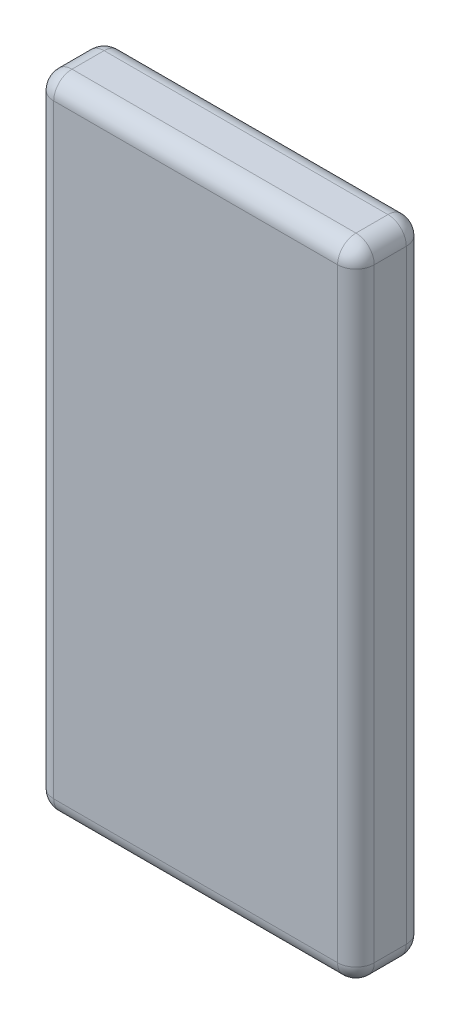
ISO-10303-21;
HEADER;
FILE_DESCRIPTION(('STEP AP214'),'2;1');
FILE_NAME('part.step','',(''),(''),'','','');
FILE_SCHEMA(('AUTOMOTIVE_DESIGN { 1 0 10303 214 1 1 1 1 }'));
ENDSEC;
DATA;
#1=APPLICATION_CONTEXT('core data for automotive mechanical design processes');
#2=APPLICATION_PROTOCOL_DEFINITION('international standard','automotive_design',2000,#1);
#3=PRODUCT_CONTEXT('',#1,'mechanical');
#4=PRODUCT('Part','Part','',(#3));
#5=PRODUCT_RELATED_PRODUCT_CATEGORY('part','',(#4));
#6=PRODUCT_DEFINITION_FORMATION('','',#4);
#7=PRODUCT_DEFINITION_CONTEXT('part definition',#1,'design');
#8=PRODUCT_DEFINITION('design','',#6,#7);
#9=PRODUCT_DEFINITION_SHAPE('','',#8);
#10=(LENGTH_UNIT() NAMED_UNIT(*) SI_UNIT(.MILLI.,.METRE.));
#11=(NAMED_UNIT(*) PLANE_ANGLE_UNIT() SI_UNIT($,.RADIAN.));
#12=(NAMED_UNIT(*) SI_UNIT($,.STERADIAN.) SOLID_ANGLE_UNIT());
#13=UNCERTAINTY_MEASURE_WITH_UNIT(LENGTH_MEASURE(1.E-05),#10,'distance_accuracy_value','');
#14=(GEOMETRIC_REPRESENTATION_CONTEXT(3) GLOBAL_UNCERTAINTY_ASSIGNED_CONTEXT((#13)) GLOBAL_UNIT_ASSIGNED_CONTEXT((#10,
#11,#12)) REPRESENTATION_CONTEXT('',''));
#15=CARTESIAN_POINT('',(0.,0.,0.));
#16=DIRECTION('',(0.,0.,1.));
#17=DIRECTION('',(1.,0.,0.));
#18=AXIS2_PLACEMENT_3D('',#15,#16,#17);
#19=CARTESIAN_POINT('',(0.,0.,15.));
#20=DIRECTION('',(-1.,0.,0.));
#21=DIRECTION('',(0.,0.,1.));
#22=AXIS2_PLACEMENT_3D('',#19,#20,#21);
#23=PLANE('',#22);
#24=DIRECTION('',(0.,0.,-1.));
#25=VECTOR('',#24,1.);
#26=CARTESIAN_POINT('',(0.,-136.,15.));
#27=LINE('',#26,#25);
#28=CARTESIAN_POINT('',(0.,-136.,11.));
#29=VERTEX_POINT('',#28);
#30=CARTESIAN_POINT('',(0.,-136.,4.));
#31=VERTEX_POINT('',#30);
#32=EDGE_CURVE('E258',#29,#31,#27,.T.);
#33=ORIENTED_EDGE('',*,*,#32,.T.);
#34=DIRECTION('',(0.,1.,0.));
#35=VECTOR('',#34,1.);
#36=CARTESIAN_POINT('',(0.,-4.,4.));
#37=LINE('',#36,#35);
#38=CARTESIAN_POINT('',(0.,-4.,4.));
#39=VERTEX_POINT('',#38);
#40=EDGE_CURVE('E11',#31,#39,#37,.T.);
#41=ORIENTED_EDGE('',*,*,#40,.T.);
#42=DIRECTION('',(0.,0.,-1.));
#43=VECTOR('',#42,1.);
#44=CARTESIAN_POINT('',(0.,-4.,15.));
#45=LINE('',#44,#43);
#46=CARTESIAN_POINT('',(0.,-4.,11.));
#47=VERTEX_POINT('',#46);
#48=EDGE_CURVE('E207',#39,#47,#45,.F.);
#49=ORIENTED_EDGE('',*,*,#48,.T.);
#50=DIRECTION('',(0.,1.,0.));
#51=VECTOR('',#50,1.);
#52=CARTESIAN_POINT('',(0.,0.,11.));
#53=LINE('',#52,#51);
#54=EDGE_CURVE('E183',#47,#29,#53,.F.);
#55=ORIENTED_EDGE('',*,*,#54,.T.);
#56=EDGE_LOOP('',(#33,#41,#49,#55));
#57=FACE_BOUND('',#56,.T.);
#58=ADVANCED_FACE('F35',(#57),#23,.F.);
#59=CARTESIAN_POINT('',(0.,0.,15.));
#60=DIRECTION('',(0.,-1.,0.));
#61=DIRECTION('',(0.,0.,-1.));
#62=AXIS2_PLACEMENT_3D('',#59,#60,#61);
#63=PLANE('',#62);
#64=DIRECTION('',(0.,0.,-1.));
#65=VECTOR('',#64,1.);
#66=CARTESIAN_POINT('',(-4.,0.,15.));
#67=LINE('',#66,#65);
#68=CARTESIAN_POINT('',(-4.,0.,11.));
#69=VERTEX_POINT('',#68);
#70=CARTESIAN_POINT('',(-4.,0.,4.));
#71=VERTEX_POINT('',#70);
#72=EDGE_CURVE('E137',#69,#71,#67,.T.);
#73=ORIENTED_EDGE('',*,*,#72,.T.);
#74=DIRECTION('',(-1.,0.,0.));
#75=VECTOR('',#74,1.);
#76=CARTESIAN_POINT('',(-66.,0.,4.));
#77=LINE('',#76,#75);
#78=CARTESIAN_POINT('',(-66.,0.,4.));
#79=VERTEX_POINT('',#78);
#80=EDGE_CURVE('E210',#71,#79,#77,.T.);
#81=ORIENTED_EDGE('',*,*,#80,.T.);
#82=DIRECTION('',(0.,0.,-1.));
#83=VECTOR('',#82,1.);
#84=CARTESIAN_POINT('',(-66.,0.,15.));
#85=LINE('',#84,#83);
#86=CARTESIAN_POINT('',(-66.,0.,11.));
#87=VERTEX_POINT('',#86);
#88=EDGE_CURVE('E164',#79,#87,#85,.F.);
#89=ORIENTED_EDGE('',*,*,#88,.T.);
#90=DIRECTION('',(-1.,0.,0.));
#91=VECTOR('',#90,1.);
#92=CARTESIAN_POINT('',(0.,0.,11.));
#93=LINE('',#92,#91);
#94=EDGE_CURVE('E178',#87,#69,#93,.F.);
#95=ORIENTED_EDGE('',*,*,#94,.T.);
#96=EDGE_LOOP('',(#73,#81,#89,#95));
#97=FACE_BOUND('',#96,.T.);
#98=ADVANCED_FACE('F267',(#97),#63,.F.);
#99=CARTESIAN_POINT('',(-70.,0.,15.));
#100=DIRECTION('',(1.,0.,0.));
#101=DIRECTION('',(0.,0.,-1.));
#102=AXIS2_PLACEMENT_3D('',#99,#100,#101);
#103=PLANE('',#102);
#104=DIRECTION('',(0.,0.,-1.));
#105=VECTOR('',#104,1.);
#106=CARTESIAN_POINT('',(-70.,-4.,15.));
#107=LINE('',#106,#105);
#108=CARTESIAN_POINT('',(-70.,-4.,11.));
#109=VERTEX_POINT('',#108);
#110=CARTESIAN_POINT('',(-70.,-4.,4.));
#111=VERTEX_POINT('',#110);
#112=EDGE_CURVE('E138',#109,#111,#107,.T.);
#113=ORIENTED_EDGE('',*,*,#112,.T.);
#114=DIRECTION('',(0.,-1.,0.));
#115=VECTOR('',#114,1.);
#116=CARTESIAN_POINT('',(-70.,-136.,4.));
#117=LINE('',#116,#115);
#118=CARTESIAN_POINT('',(-70.,-136.,4.));
#119=VERTEX_POINT('',#118);
#120=EDGE_CURVE('E133',#111,#119,#117,.T.);
#121=ORIENTED_EDGE('',*,*,#120,.T.);
#122=DIRECTION('',(0.,0.,-1.));
#123=VECTOR('',#122,1.);
#124=CARTESIAN_POINT('',(-70.,-136.,15.));
#125=LINE('',#124,#123);
#126=CARTESIAN_POINT('',(-70.,-136.,11.));
#127=VERTEX_POINT('',#126);
#128=EDGE_CURVE('E125',#119,#127,#125,.F.);
#129=ORIENTED_EDGE('',*,*,#128,.T.);
#130=DIRECTION('',(0.,-1.,0.));
#131=VECTOR('',#130,1.);
#132=CARTESIAN_POINT('',(-70.,0.,11.));
#133=LINE('',#132,#131);
#134=EDGE_CURVE('E130',#127,#109,#133,.F.);
#135=ORIENTED_EDGE('',*,*,#134,.T.);
#136=EDGE_LOOP('',(#113,#121,#129,#135));
#137=FACE_BOUND('',#136,.T.);
#138=ADVANCED_FACE('F128',(#137),#103,.F.);
#139=CARTESIAN_POINT('',(0.,-140.,15.));
#140=DIRECTION('',(0.,1.,0.));
#141=DIRECTION('',(0.,0.,1.));
#142=AXIS2_PLACEMENT_3D('',#139,#140,#141);
#143=PLANE('',#142);
#144=DIRECTION('',(0.,0.,-1.));
#145=VECTOR('',#144,1.);
#146=CARTESIAN_POINT('',(-66.,-140.,15.));
#147=LINE('',#146,#145);
#148=CARTESIAN_POINT('',(-66.,-140.,11.));
#149=VERTEX_POINT('',#148);
#150=CARTESIAN_POINT('',(-66.,-140.,4.));
#151=VERTEX_POINT('',#150);
#152=EDGE_CURVE('E162',#149,#151,#147,.T.);
#153=ORIENTED_EDGE('',*,*,#152,.T.);
#154=DIRECTION('',(1.,0.,0.));
#155=VECTOR('',#154,1.);
#156=CARTESIAN_POINT('',(-4.,-140.,4.));
#157=LINE('',#156,#155);
#158=CARTESIAN_POINT('',(-4.,-140.,4.));
#159=VERTEX_POINT('',#158);
#160=EDGE_CURVE('E59',#151,#159,#157,.T.);
#161=ORIENTED_EDGE('',*,*,#160,.T.);
#162=DIRECTION('',(0.,0.,-1.));
#163=VECTOR('',#162,1.);
#164=CARTESIAN_POINT('',(-4.,-140.,15.));
#165=LINE('',#164,#163);
#166=CARTESIAN_POINT('',(-4.,-140.,11.));
#167=VERTEX_POINT('',#166);
#168=EDGE_CURVE('E257',#159,#167,#165,.F.);
#169=ORIENTED_EDGE('',*,*,#168,.T.);
#170=DIRECTION('',(1.,0.,0.));
#171=VECTOR('',#170,1.);
#172=CARTESIAN_POINT('',(0.,-140.,11.));
#173=LINE('',#172,#171);
#174=EDGE_CURVE('E188',#167,#149,#173,.F.);
#175=ORIENTED_EDGE('',*,*,#174,.T.);
#176=EDGE_LOOP('',(#153,#161,#169,#175));
#177=FACE_BOUND('',#176,.T.);
#178=ADVANCED_FACE('F255',(#177),#143,.F.);
#179=CARTESIAN_POINT('',(0.,0.,15.));
#180=DIRECTION('',(0.,0.,-1.));
#181=DIRECTION('',(-1.,0.,0.));
#182=AXIS2_PLACEMENT_3D('',#179,#180,#181);
#183=PLANE('',#182);
#184=DIRECTION('',(-1.,0.,0.));
#185=VECTOR('',#184,1.);
#186=CARTESIAN_POINT('',(0.,-4.,15.));
#187=LINE('',#186,#185);
#188=CARTESIAN_POINT('',(-4.,-4.,15.));
#189=VERTEX_POINT('',#188);
#190=CARTESIAN_POINT('',(-66.,-4.,15.));
#191=VERTEX_POINT('',#190);
#192=EDGE_CURVE('E172',#189,#191,#187,.T.);
#193=ORIENTED_EDGE('',*,*,#192,.T.);
#194=DIRECTION('',(0.,-1.,0.));
#195=VECTOR('',#194,1.);
#196=CARTESIAN_POINT('',(-66.,0.,15.));
#197=LINE('',#196,#195);
#198=CARTESIAN_POINT('',(-66.,-136.,15.));
#199=VERTEX_POINT('',#198);
#200=EDGE_CURVE('E158',#191,#199,#197,.T.);
#201=ORIENTED_EDGE('',*,*,#200,.T.);
#202=DIRECTION('',(1.,0.,0.));
#203=VECTOR('',#202,1.);
#204=CARTESIAN_POINT('',(0.,-136.,15.));
#205=LINE('',#204,#203);
#206=CARTESIAN_POINT('',(-4.,-136.,15.));
#207=VERTEX_POINT('',#206);
#208=EDGE_CURVE('E163',#199,#207,#205,.T.);
#209=ORIENTED_EDGE('',*,*,#208,.T.);
#210=DIRECTION('',(0.,1.,0.));
#211=VECTOR('',#210,1.);
#212=CARTESIAN_POINT('',(-4.,0.,15.));
#213=LINE('',#212,#211);
#214=EDGE_CURVE('E166',#207,#189,#213,.T.);
#215=ORIENTED_EDGE('',*,*,#214,.T.);
#216=EDGE_LOOP('',(#193,#201,#209,#215));
#217=FACE_BOUND('',#216,.T.);
#218=ADVANCED_FACE('F286',(#217),#183,.F.);
#219=CARTESIAN_POINT('',(0.,0.,0.));
#220=DIRECTION('',(0.,0.,-1.));
#221=DIRECTION('',(-1.,0.,0.));
#222=AXIS2_PLACEMENT_3D('',#219,#220,#221);
#223=PLANE('',#222);
#224=DIRECTION('',(0.,-1.,0.));
#225=VECTOR('',#224,1.);
#226=CARTESIAN_POINT('',(-66.,-4.,0.));
#227=LINE('',#226,#225);
#228=CARTESIAN_POINT('',(-66.,-136.,0.));
#229=VERTEX_POINT('',#228);
#230=CARTESIAN_POINT('',(-66.,-4.,0.));
#231=VERTEX_POINT('',#230);
#232=EDGE_CURVE('E216',#229,#231,#227,.F.);
#233=ORIENTED_EDGE('',*,*,#232,.T.);
#234=DIRECTION('',(-1.,0.,0.));
#235=VECTOR('',#234,1.);
#236=CARTESIAN_POINT('',(-4.,-4.,0.));
#237=LINE('',#236,#235);
#238=CARTESIAN_POINT('',(-4.,-4.,0.));
#239=VERTEX_POINT('',#238);
#240=EDGE_CURVE('E218',#231,#239,#237,.F.);
#241=ORIENTED_EDGE('',*,*,#240,.T.);
#242=DIRECTION('',(0.,1.,0.));
#243=VECTOR('',#242,1.);
#244=CARTESIAN_POINT('',(-4.,-136.,0.));
#245=LINE('',#244,#243);
#246=CARTESIAN_POINT('',(-4.,-136.,0.));
#247=VERTEX_POINT('',#246);
#248=EDGE_CURVE('E212',#239,#247,#245,.F.);
#249=ORIENTED_EDGE('',*,*,#248,.T.);
#250=DIRECTION('',(1.,0.,0.));
#251=VECTOR('',#250,1.);
#252=CARTESIAN_POINT('',(-66.,-136.,0.));
#253=LINE('',#252,#251);
#254=EDGE_CURVE('E214',#247,#229,#253,.F.);
#255=ORIENTED_EDGE('',*,*,#254,.T.);
#256=EDGE_LOOP('',(#233,#241,#249,#255));
#257=FACE_BOUND('',#256,.T.);
#258=ADVANCED_FACE('F319',(#257),#223,.T.);
#259=CARTESIAN_POINT('',(-4.,-136.,15.));
#260=DIRECTION('',(0.,0.,-1.));
#261=DIRECTION('',(-1.,0.,0.));
#262=AXIS2_PLACEMENT_3D('',#259,#260,#261);
#263=CYLINDRICAL_SURFACE('',#262,4.);
#264=ORIENTED_EDGE('',*,*,#168,.F.);
#265=CARTESIAN_POINT('',(-4.,-136.,4.));
#266=DIRECTION('',(0.,0.,-1.));
#267=DIRECTION('',(-1.,0.,0.));
#268=AXIS2_PLACEMENT_3D('',#265,#266,#267);
#269=CIRCLE('',#268,4.);
#270=EDGE_CURVE('E44',#159,#31,#269,.F.);
#271=ORIENTED_EDGE('',*,*,#270,.T.);
#272=ORIENTED_EDGE('',*,*,#32,.F.);
#273=CARTESIAN_POINT('',(-4.,-136.,11.));
#274=DIRECTION('',(0.,0.,-1.));
#275=DIRECTION('',(-1.,0.,0.));
#276=AXIS2_PLACEMENT_3D('',#273,#274,#275);
#277=CIRCLE('',#276,4.);
#278=EDGE_CURVE('E185',#29,#167,#277,.T.);
#279=ORIENTED_EDGE('',*,*,#278,.T.);
#280=EDGE_LOOP('',(#264,#271,#272,#279));
#281=FACE_BOUND('',#280,.T.);
#282=ADVANCED_FACE('F294',(#281),#263,.T.);
#283=CARTESIAN_POINT('',(-66.,-136.,15.));
#284=DIRECTION('',(0.,0.,-1.));
#285=DIRECTION('',(-1.,0.,0.));
#286=AXIS2_PLACEMENT_3D('',#283,#284,#285);
#287=CYLINDRICAL_SURFACE('',#286,4.);
#288=ORIENTED_EDGE('',*,*,#128,.F.);
#289=CARTESIAN_POINT('',(-66.,-136.,4.));
#290=DIRECTION('',(0.,0.,-1.));
#291=DIRECTION('',(-1.,0.,0.));
#292=AXIS2_PLACEMENT_3D('',#289,#290,#291);
#293=CIRCLE('',#292,4.);
#294=EDGE_CURVE('E224',#119,#151,#293,.F.);
#295=ORIENTED_EDGE('',*,*,#294,.T.);
#296=ORIENTED_EDGE('',*,*,#152,.F.);
#297=CARTESIAN_POINT('',(-66.,-136.,11.));
#298=DIRECTION('',(0.,0.,-1.));
#299=DIRECTION('',(-1.,0.,0.));
#300=AXIS2_PLACEMENT_3D('',#297,#298,#299);
#301=CIRCLE('',#300,4.);
#302=EDGE_CURVE('E145',#149,#127,#301,.T.);
#303=ORIENTED_EDGE('',*,*,#302,.T.);
#304=EDGE_LOOP('',(#288,#295,#296,#303));
#305=FACE_BOUND('',#304,.T.);
#306=ADVANCED_FACE('F161',(#305),#287,.T.);
#307=CARTESIAN_POINT('',(-66.,-4.,15.));
#308=DIRECTION('',(0.,0.,-1.));
#309=DIRECTION('',(-1.,0.,0.));
#310=AXIS2_PLACEMENT_3D('',#307,#308,#309);
#311=CYLINDRICAL_SURFACE('',#310,4.);
#312=ORIENTED_EDGE('',*,*,#88,.F.);
#313=CARTESIAN_POINT('',(-66.,-4.,4.));
#314=DIRECTION('',(0.,0.,-1.));
#315=DIRECTION('',(-1.,0.,0.));
#316=AXIS2_PLACEMENT_3D('',#313,#314,#315);
#317=CIRCLE('',#316,4.);
#318=EDGE_CURVE('E221',#79,#111,#317,.F.);
#319=ORIENTED_EDGE('',*,*,#318,.T.);
#320=ORIENTED_EDGE('',*,*,#112,.F.);
#321=CARTESIAN_POINT('',(-66.,-4.,11.));
#322=DIRECTION('',(0.,0.,-1.));
#323=DIRECTION('',(-1.,0.,0.));
#324=AXIS2_PLACEMENT_3D('',#321,#322,#323);
#325=CIRCLE('',#324,4.);
#326=EDGE_CURVE('E157',#109,#87,#325,.T.);
#327=ORIENTED_EDGE('',*,*,#326,.T.);
#328=EDGE_LOOP('',(#312,#319,#320,#327));
#329=FACE_BOUND('',#328,.T.);
#330=ADVANCED_FACE('F322',(#329),#311,.T.);
#331=CARTESIAN_POINT('',(-4.,-4.,15.));
#332=DIRECTION('',(0.,0.,-1.));
#333=DIRECTION('',(-1.,0.,0.));
#334=AXIS2_PLACEMENT_3D('',#331,#332,#333);
#335=CYLINDRICAL_SURFACE('',#334,4.);
#336=ORIENTED_EDGE('',*,*,#48,.F.);
#337=CARTESIAN_POINT('',(-4.,-4.,4.));
#338=DIRECTION('',(0.,0.,-1.));
#339=DIRECTION('',(-1.,0.,0.));
#340=AXIS2_PLACEMENT_3D('',#337,#338,#339);
#341=CIRCLE('',#340,4.);
#342=EDGE_CURVE('E190',#39,#71,#341,.F.);
#343=ORIENTED_EDGE('',*,*,#342,.T.);
#344=ORIENTED_EDGE('',*,*,#72,.F.);
#345=CARTESIAN_POINT('',(-4.,-4.,11.));
#346=DIRECTION('',(0.,0.,-1.));
#347=DIRECTION('',(-1.,0.,0.));
#348=AXIS2_PLACEMENT_3D('',#345,#346,#347);
#349=CIRCLE('',#348,4.);
#350=EDGE_CURVE('E180',#69,#47,#349,.T.);
#351=ORIENTED_EDGE('',*,*,#350,.T.);
#352=EDGE_LOOP('',(#336,#343,#344,#351));
#353=FACE_BOUND('',#352,.T.);
#354=ADVANCED_FACE('F274',(#353),#335,.T.);
#355=CARTESIAN_POINT('',(-4.,-4.,11.));
#356=DIRECTION('',(0.,0.,-1.));
#357=DIRECTION('',(-1.,0.,0.));
#358=AXIS2_PLACEMENT_3D('',#355,#356,#357);
#359=SPHERICAL_SURFACE('',#358,4.);
#360=CARTESIAN_POINT('',(-4.,-4.,11.));
#361=DIRECTION('',(0.,-1.,0.));
#362=DIRECTION('',(0.,0.,-1.));
#363=AXIS2_PLACEMENT_3D('',#360,#361,#362);
#364=CIRCLE('',#363,4.);
#365=EDGE_CURVE('E201',#47,#189,#364,.T.);
#366=ORIENTED_EDGE('',*,*,#365,.F.);
#367=ORIENTED_EDGE('',*,*,#350,.F.);
#368=CARTESIAN_POINT('',(-4.,-4.,11.));
#369=DIRECTION('',(-1.,0.,0.));
#370=DIRECTION('',(0.,0.,1.));
#371=AXIS2_PLACEMENT_3D('',#368,#369,#370);
#372=CIRCLE('',#371,4.);
#373=EDGE_CURVE('E204',#189,#69,#372,.T.);
#374=ORIENTED_EDGE('',*,*,#373,.F.);
#375=EDGE_LOOP('',(#366,#367,#374));
#376=FACE_BOUND('',#375,.T.);
#377=ADVANCED_FACE('F279',(#376),#359,.T.);
#378=CARTESIAN_POINT('',(0.,-4.,11.));
#379=DIRECTION('',(-1.,0.,0.));
#380=DIRECTION('',(0.,0.,1.));
#381=AXIS2_PLACEMENT_3D('',#378,#379,#380);
#382=CYLINDRICAL_SURFACE('',#381,4.);
#383=ORIENTED_EDGE('',*,*,#373,.T.);
#384=ORIENTED_EDGE('',*,*,#94,.F.);
#385=CARTESIAN_POINT('',(-66.,-4.,11.));
#386=DIRECTION('',(-1.,0.,0.));
#387=DIRECTION('',(0.,0.,1.));
#388=AXIS2_PLACEMENT_3D('',#385,#386,#387);
#389=CIRCLE('',#388,4.);
#390=EDGE_CURVE('E198',#191,#87,#389,.T.);
#391=ORIENTED_EDGE('',*,*,#390,.F.);
#392=ORIENTED_EDGE('',*,*,#192,.F.);
#393=EDGE_LOOP('',(#383,#384,#391,#392));
#394=FACE_BOUND('',#393,.T.);
#395=ADVANCED_FACE('F283',(#394),#382,.T.);
#396=CARTESIAN_POINT('',(-4.,0.,11.));
#397=DIRECTION('',(0.,1.,0.));
#398=DIRECTION('',(0.,0.,1.));
#399=AXIS2_PLACEMENT_3D('',#396,#397,#398);
#400=CYLINDRICAL_SURFACE('',#399,4.);
#401=ORIENTED_EDGE('',*,*,#365,.T.);
#402=ORIENTED_EDGE('',*,*,#214,.F.);
#403=CARTESIAN_POINT('',(-4.,-136.,11.));
#404=DIRECTION('',(0.,-1.,0.));
#405=DIRECTION('',(0.,0.,-1.));
#406=AXIS2_PLACEMENT_3D('',#403,#404,#405);
#407=CIRCLE('',#406,4.);
#408=EDGE_CURVE('E195',#29,#207,#407,.T.);
#409=ORIENTED_EDGE('',*,*,#408,.F.);
#410=ORIENTED_EDGE('',*,*,#54,.F.);
#411=EDGE_LOOP('',(#401,#402,#409,#410));
#412=FACE_BOUND('',#411,.T.);
#413=ADVANCED_FACE('F290',(#412),#400,.T.);
#414=CARTESIAN_POINT('',(-66.,-4.,11.));
#415=DIRECTION('',(0.,0.,-1.));
#416=DIRECTION('',(-1.,0.,0.));
#417=AXIS2_PLACEMENT_3D('',#414,#415,#416);
#418=SPHERICAL_SURFACE('',#417,4.);
#419=ORIENTED_EDGE('',*,*,#390,.T.);
#420=ORIENTED_EDGE('',*,*,#326,.F.);
#421=CARTESIAN_POINT('',(-66.,-4.,11.));
#422=DIRECTION('',(0.,-1.,0.));
#423=DIRECTION('',(0.,0.,-1.));
#424=AXIS2_PLACEMENT_3D('',#421,#422,#423);
#425=CIRCLE('',#424,4.);
#426=EDGE_CURVE('E156',#191,#109,#425,.T.);
#427=ORIENTED_EDGE('',*,*,#426,.F.);
#428=EDGE_LOOP('',(#419,#420,#427));
#429=FACE_BOUND('',#428,.T.);
#430=ADVANCED_FACE('F455',(#429),#418,.T.);
#431=CARTESIAN_POINT('',(-4.,-136.,11.));
#432=DIRECTION('',(0.,0.,-1.));
#433=DIRECTION('',(-1.,0.,0.));
#434=AXIS2_PLACEMENT_3D('',#431,#432,#433);
#435=SPHERICAL_SURFACE('',#434,4.);
#436=ORIENTED_EDGE('',*,*,#278,.F.);
#437=ORIENTED_EDGE('',*,*,#408,.T.);
#438=CARTESIAN_POINT('',(-4.,-136.,11.));
#439=DIRECTION('',(-1.,0.,0.));
#440=DIRECTION('',(0.,0.,1.));
#441=AXIS2_PLACEMENT_3D('',#438,#439,#440);
#442=CIRCLE('',#441,4.);
#443=EDGE_CURVE('E151',#167,#207,#442,.T.);
#444=ORIENTED_EDGE('',*,*,#443,.F.);
#445=EDGE_LOOP('',(#436,#437,#444));
#446=FACE_BOUND('',#445,.T.);
#447=ADVANCED_FACE('F298',(#446),#435,.T.);
#448=CARTESIAN_POINT('',(-66.,0.,11.));
#449=DIRECTION('',(0.,-1.,0.));
#450=DIRECTION('',(0.,0.,-1.));
#451=AXIS2_PLACEMENT_3D('',#448,#449,#450);
#452=CYLINDRICAL_SURFACE('',#451,4.);
#453=ORIENTED_EDGE('',*,*,#426,.T.);
#454=ORIENTED_EDGE('',*,*,#134,.F.);
#455=CARTESIAN_POINT('',(-66.,-136.,11.));
#456=DIRECTION('',(0.,-1.,0.));
#457=DIRECTION('',(0.,0.,-1.));
#458=AXIS2_PLACEMENT_3D('',#455,#456,#457);
#459=CIRCLE('',#458,4.);
#460=EDGE_CURVE('E143',#199,#127,#459,.T.);
#461=ORIENTED_EDGE('',*,*,#460,.F.);
#462=ORIENTED_EDGE('',*,*,#200,.F.);
#463=EDGE_LOOP('',(#453,#454,#461,#462));
#464=FACE_BOUND('',#463,.T.);
#465=ADVANCED_FACE('F154',(#464),#452,.T.);
#466=CARTESIAN_POINT('',(0.,-136.,11.));
#467=DIRECTION('',(1.,0.,0.));
#468=DIRECTION('',(0.,0.,-1.));
#469=AXIS2_PLACEMENT_3D('',#466,#467,#468);
#470=CYLINDRICAL_SURFACE('',#469,4.);
#471=ORIENTED_EDGE('',*,*,#443,.T.);
#472=ORIENTED_EDGE('',*,*,#208,.F.);
#473=CARTESIAN_POINT('',(-66.,-136.,11.));
#474=DIRECTION('',(-1.,0.,0.));
#475=DIRECTION('',(0.,0.,1.));
#476=AXIS2_PLACEMENT_3D('',#473,#474,#475);
#477=CIRCLE('',#476,4.);
#478=EDGE_CURVE('E147',#149,#199,#477,.T.);
#479=ORIENTED_EDGE('',*,*,#478,.F.);
#480=ORIENTED_EDGE('',*,*,#174,.F.);
#481=EDGE_LOOP('',(#471,#472,#479,#480));
#482=FACE_BOUND('',#481,.T.);
#483=ADVANCED_FACE('F300',(#482),#470,.T.);
#484=CARTESIAN_POINT('',(-66.,-136.,11.));
#485=DIRECTION('',(0.,0.,-1.));
#486=DIRECTION('',(-1.,0.,0.));
#487=AXIS2_PLACEMENT_3D('',#484,#485,#486);
#488=SPHERICAL_SURFACE('',#487,4.);
#489=ORIENTED_EDGE('',*,*,#460,.T.);
#490=ORIENTED_EDGE('',*,*,#302,.F.);
#491=ORIENTED_EDGE('',*,*,#478,.T.);
#492=EDGE_LOOP('',(#489,#490,#491));
#493=FACE_BOUND('',#492,.T.);
#494=ADVANCED_FACE('F144',(#493),#488,.T.);
#495=CARTESIAN_POINT('',(-66.,-136.,4.));
#496=DIRECTION('',(0.,0.,-1.));
#497=DIRECTION('',(-1.,0.,0.));
#498=AXIS2_PLACEMENT_3D('',#495,#496,#497);
#499=SPHERICAL_SURFACE('',#498,4.);
#500=CARTESIAN_POINT('',(-66.,-136.,4.));
#501=DIRECTION('',(1.,0.,0.));
#502=DIRECTION('',(0.,0.,-1.));
#503=AXIS2_PLACEMENT_3D('',#500,#501,#502);
#504=CIRCLE('',#503,4.);
#505=EDGE_CURVE('E243',#151,#229,#504,.T.);
#506=ORIENTED_EDGE('',*,*,#505,.F.);
#507=ORIENTED_EDGE('',*,*,#294,.F.);
#508=CARTESIAN_POINT('',(-66.,-136.,4.));
#509=DIRECTION('',(0.,1.,0.));
#510=DIRECTION('',(0.,0.,1.));
#511=AXIS2_PLACEMENT_3D('',#508,#509,#510);
#512=CIRCLE('',#511,4.);
#513=EDGE_CURVE('E39',#229,#119,#512,.T.);
#514=ORIENTED_EDGE('',*,*,#513,.F.);
#515=EDGE_LOOP('',(#506,#507,#514));
#516=FACE_BOUND('',#515,.T.);
#517=ADVANCED_FACE('F37',(#516),#499,.T.);
#518=CARTESIAN_POINT('',(-66.,0.,4.));
#519=DIRECTION('',(0.,1.,0.));
#520=DIRECTION('',(0.,0.,1.));
#521=AXIS2_PLACEMENT_3D('',#518,#519,#520);
#522=CYLINDRICAL_SURFACE('',#521,4.);
#523=ORIENTED_EDGE('',*,*,#513,.T.);
#524=ORIENTED_EDGE('',*,*,#120,.F.);
#525=CARTESIAN_POINT('',(-66.,-4.,4.));
#526=DIRECTION('',(0.,1.,0.));
#527=DIRECTION('',(0.,0.,1.));
#528=AXIS2_PLACEMENT_3D('',#525,#526,#527);
#529=CIRCLE('',#528,4.);
#530=EDGE_CURVE('E241',#231,#111,#529,.T.);
#531=ORIENTED_EDGE('',*,*,#530,.F.);
#532=ORIENTED_EDGE('',*,*,#232,.F.);
#533=EDGE_LOOP('',(#523,#524,#531,#532));
#534=FACE_BOUND('',#533,.T.);
#535=ADVANCED_FACE('F252',(#534),#522,.T.);
#536=CARTESIAN_POINT('',(0.,-136.,4.));
#537=DIRECTION('',(-1.,0.,0.));
#538=DIRECTION('',(0.,0.,1.));
#539=AXIS2_PLACEMENT_3D('',#536,#537,#538);
#540=CYLINDRICAL_SURFACE('',#539,4.);
#541=ORIENTED_EDGE('',*,*,#505,.T.);
#542=ORIENTED_EDGE('',*,*,#254,.F.);
#543=CARTESIAN_POINT('',(-4.,-136.,4.));
#544=DIRECTION('',(1.,0.,0.));
#545=DIRECTION('',(0.,0.,-1.));
#546=AXIS2_PLACEMENT_3D('',#543,#544,#545);
#547=CIRCLE('',#546,4.);
#548=EDGE_CURVE('E238',#159,#247,#547,.T.);
#549=ORIENTED_EDGE('',*,*,#548,.F.);
#550=ORIENTED_EDGE('',*,*,#160,.F.);
#551=EDGE_LOOP('',(#541,#542,#549,#550));
#552=FACE_BOUND('',#551,.T.);
#553=ADVANCED_FACE('F356',(#552),#540,.T.);
#554=CARTESIAN_POINT('',(-66.,-4.,4.));
#555=DIRECTION('',(0.,0.,-1.));
#556=DIRECTION('',(-1.,0.,0.));
#557=AXIS2_PLACEMENT_3D('',#554,#555,#556);
#558=SPHERICAL_SURFACE('',#557,4.);
#559=ORIENTED_EDGE('',*,*,#530,.T.);
#560=ORIENTED_EDGE('',*,*,#318,.F.);
#561=CARTESIAN_POINT('',(-66.,-4.,4.));
#562=DIRECTION('',(1.,0.,0.));
#563=DIRECTION('',(0.,0.,-1.));
#564=AXIS2_PLACEMENT_3D('',#561,#562,#563);
#565=CIRCLE('',#564,4.);
#566=EDGE_CURVE('E235',#231,#79,#565,.T.);
#567=ORIENTED_EDGE('',*,*,#566,.F.);
#568=EDGE_LOOP('',(#559,#560,#567));
#569=FACE_BOUND('',#568,.T.);
#570=ADVANCED_FACE('F352',(#569),#558,.T.);
#571=CARTESIAN_POINT('',(-4.,-136.,4.));
#572=DIRECTION('',(0.,0.,-1.));
#573=DIRECTION('',(-1.,0.,0.));
#574=AXIS2_PLACEMENT_3D('',#571,#572,#573);
#575=SPHERICAL_SURFACE('',#574,4.);
#576=ORIENTED_EDGE('',*,*,#270,.F.);
#577=ORIENTED_EDGE('',*,*,#548,.T.);
#578=CARTESIAN_POINT('',(-4.,-136.,4.));
#579=DIRECTION('',(0.,1.,0.));
#580=DIRECTION('',(0.,0.,1.));
#581=AXIS2_PLACEMENT_3D('',#578,#579,#580);
#582=CIRCLE('',#581,4.);
#583=EDGE_CURVE('E232',#31,#247,#582,.T.);
#584=ORIENTED_EDGE('',*,*,#583,.F.);
#585=EDGE_LOOP('',(#576,#577,#584));
#586=FACE_BOUND('',#585,.T.);
#587=ADVANCED_FACE('F348',(#586),#575,.T.);
#588=CARTESIAN_POINT('',(0.,-4.,4.));
#589=DIRECTION('',(1.,0.,0.));
#590=DIRECTION('',(0.,0.,-1.));
#591=AXIS2_PLACEMENT_3D('',#588,#589,#590);
#592=CYLINDRICAL_SURFACE('',#591,4.);
#593=ORIENTED_EDGE('',*,*,#566,.T.);
#594=ORIENTED_EDGE('',*,*,#80,.F.);
#595=CARTESIAN_POINT('',(-4.,-4.,4.));
#596=DIRECTION('',(1.,0.,0.));
#597=DIRECTION('',(0.,0.,-1.));
#598=AXIS2_PLACEMENT_3D('',#595,#596,#597);
#599=CIRCLE('',#598,4.);
#600=EDGE_CURVE('E230',#239,#71,#599,.T.);
#601=ORIENTED_EDGE('',*,*,#600,.F.);
#602=ORIENTED_EDGE('',*,*,#240,.F.);
#603=EDGE_LOOP('',(#593,#594,#601,#602));
#604=FACE_BOUND('',#603,.T.);
#605=ADVANCED_FACE('F344',(#604),#592,.T.);
#606=CARTESIAN_POINT('',(-4.,0.,4.));
#607=DIRECTION('',(0.,-1.,0.));
#608=DIRECTION('',(0.,0.,-1.));
#609=AXIS2_PLACEMENT_3D('',#606,#607,#608);
#610=CYLINDRICAL_SURFACE('',#609,4.);
#611=ORIENTED_EDGE('',*,*,#583,.T.);
#612=ORIENTED_EDGE('',*,*,#248,.F.);
#613=CARTESIAN_POINT('',(-4.,-4.,4.));
#614=DIRECTION('',(0.,1.,0.));
#615=DIRECTION('',(0.,0.,1.));
#616=AXIS2_PLACEMENT_3D('',#613,#614,#615);
#617=CIRCLE('',#616,4.);
#618=EDGE_CURVE('E228',#39,#239,#617,.T.);
#619=ORIENTED_EDGE('',*,*,#618,.F.);
#620=ORIENTED_EDGE('',*,*,#40,.F.);
#621=EDGE_LOOP('',(#611,#612,#619,#620));
#622=FACE_BOUND('',#621,.T.);
#623=ADVANCED_FACE('F340',(#622),#610,.T.);
#624=CARTESIAN_POINT('',(-4.,-4.,4.));
#625=DIRECTION('',(0.,0.,-1.));
#626=DIRECTION('',(-1.,0.,0.));
#627=AXIS2_PLACEMENT_3D('',#624,#625,#626);
#628=SPHERICAL_SURFACE('',#627,4.);
#629=ORIENTED_EDGE('',*,*,#600,.T.);
#630=ORIENTED_EDGE('',*,*,#342,.F.);
#631=ORIENTED_EDGE('',*,*,#618,.T.);
#632=EDGE_LOOP('',(#629,#630,#631));
#633=FACE_BOUND('',#632,.T.);
#634=ADVANCED_FACE('F337',(#633),#628,.T.);
#635=CLOSED_SHELL('',(#58,#98,#138,#178,#218,#258,#282,#306,#330,#354,#377,#395,#413,#430,#447,
#465,#483,#494,#517,#535,#553,#570,#587,#605,#623,#634));
#636=MANIFOLD_SOLID_BREP('B2',#635);
#637=ADVANCED_BREP_SHAPE_REPRESENTATION('',(#18,#636),#14);
#638=SHAPE_DEFINITION_REPRESENTATION(#9,#637);
ENDSEC;
END-ISO-10303-21;
